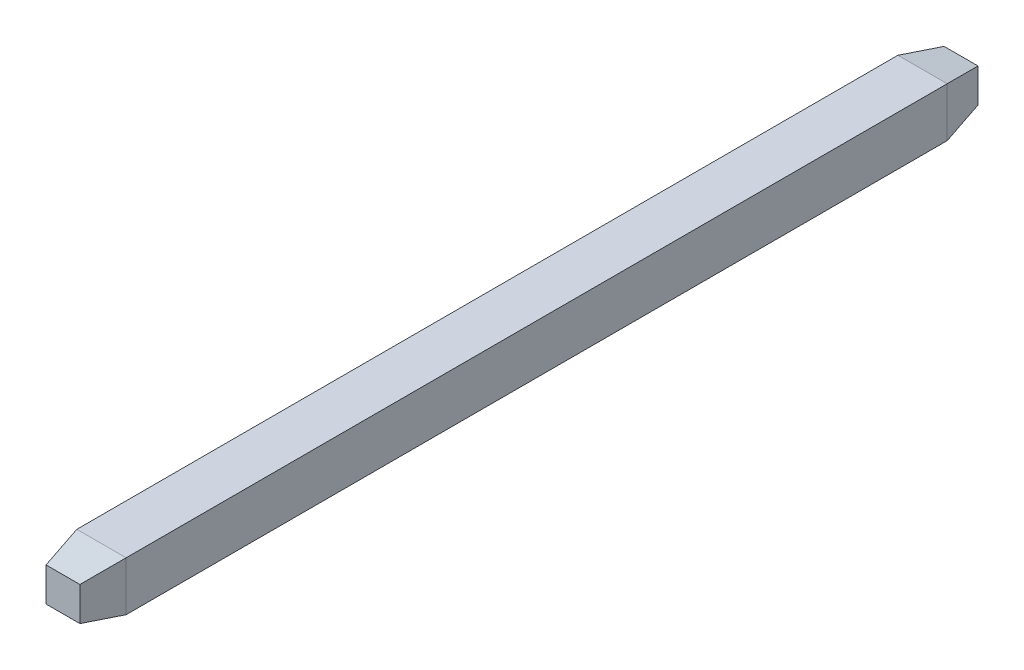
ISO-10303-21;
HEADER;
FILE_DESCRIPTION(('STEP AP214'),'2;1');
FILE_NAME('part.step','',(''),(''),'','','');
FILE_SCHEMA(('AUTOMOTIVE_DESIGN { 1 0 10303 214 1 1 1 1 }'));
ENDSEC;
DATA;
#1=APPLICATION_CONTEXT('core data for automotive mechanical design processes');
#2=APPLICATION_PROTOCOL_DEFINITION('international standard','automotive_design',2000,#1);
#3=PRODUCT_CONTEXT('',#1,'mechanical');
#4=PRODUCT('Part','Part','',(#3));
#5=PRODUCT_RELATED_PRODUCT_CATEGORY('part','',(#4));
#6=PRODUCT_DEFINITION_FORMATION('','',#4);
#7=PRODUCT_DEFINITION_CONTEXT('part definition',#1,'design');
#8=PRODUCT_DEFINITION('design','',#6,#7);
#9=PRODUCT_DEFINITION_SHAPE('','',#8);
#10=(LENGTH_UNIT() NAMED_UNIT(*) SI_UNIT(.MILLI.,.METRE.));
#11=(NAMED_UNIT(*) PLANE_ANGLE_UNIT() SI_UNIT($,.RADIAN.));
#12=(NAMED_UNIT(*) SI_UNIT($,.STERADIAN.) SOLID_ANGLE_UNIT());
#13=UNCERTAINTY_MEASURE_WITH_UNIT(LENGTH_MEASURE(1.E-05),#10,'distance_accuracy_value','');
#14=(GEOMETRIC_REPRESENTATION_CONTEXT(3) GLOBAL_UNCERTAINTY_ASSIGNED_CONTEXT((#13)) GLOBAL_UNIT_ASSIGNED_CONTEXT((#10,
#11,#12)) REPRESENTATION_CONTEXT('',''));
#15=CARTESIAN_POINT('',(0.,0.,0.));
#16=DIRECTION('',(0.,0.,1.));
#17=DIRECTION('',(1.,0.,0.));
#18=AXIS2_PLACEMENT_3D('',#15,#16,#17);
#19=CARTESIAN_POINT('',(-0.269999999999936,0.,-3.0000000000007));
#20=DIRECTION('',(-0.980580675690916,0.,-0.196116135138203));
#21=DIRECTION('',(-0.196116135138203,0.,0.980580675690916));
#22=AXIS2_PLACEMENT_3D('',#19,#20,#21);
#23=PLANE('',#22);
#24=DIRECTION('',(0.192450089729649,0.192450089729903,-0.962250448649416));
#25=VECTOR('',#24,1.);
#26=CARTESIAN_POINT('',(-0.31999999999999,-0.320000000000239,-2.74999999999921));
#27=LINE('',#26,#25);
#28=CARTESIAN_POINT('',(-0.320000000000115,-0.320000000000021,-2.74999999999919));
#29=VERTEX_POINT('',#28);
#30=CARTESIAN_POINT('',(-0.220000000000068,-0.220000000000038,-3.24999999999972));
#31=VERTEX_POINT('',#30);
#32=EDGE_CURVE('E20',#29,#31,#27,.T.);
#33=ORIENTED_EDGE('',*,*,#32,.F.);
#34=DIRECTION('',(0.,1.,0.));
#35=VECTOR('',#34,1.);
#36=CARTESIAN_POINT('',(-0.31999999999999,0.31999999999999,-2.74999999999916));
#37=LINE('',#36,#35);
#38=CARTESIAN_POINT('',(-0.320000000000115,0.320000000000052,-2.7499999999992));
#39=VERTEX_POINT('',#38);
#40=EDGE_CURVE('E104',#39,#29,#37,.F.);
#41=ORIENTED_EDGE('',*,*,#40,.F.);
#42=DIRECTION('',(-0.192450089729649,0.192450089729903,0.962250448649416));
#43=VECTOR('',#42,1.);
#44=CARTESIAN_POINT('',(-0.220000000000009,0.220000000000126,-3.24999999999972));
#45=LINE('',#44,#43);
#46=CARTESIAN_POINT('',(-0.220000000000038,0.220000000000038,-3.24999999999971));
#47=VERTEX_POINT('',#46);
#48=EDGE_CURVE('E85',#47,#39,#45,.T.);
#49=ORIENTED_EDGE('',*,*,#48,.F.);
#50=DIRECTION('',(0.,1.,0.));
#51=VECTOR('',#50,1.);
#52=CARTESIAN_POINT('',(-0.220000000000009,0.,-3.2499999999997));
#53=LINE('',#52,#51);
#54=EDGE_CURVE('E79',#47,#31,#53,.F.);
#55=ORIENTED_EDGE('',*,*,#54,.T.);
#56=EDGE_LOOP('',(#33,#41,#49,#55));
#57=FACE_BOUND('',#56,.T.);
#58=ADVANCED_FACE('F17',(#57),#23,.T.);
#59=CARTESIAN_POINT('',(-0.269999999999936,0.,8.157400000001));
#60=DIRECTION('',(-0.980580675690916,0.,0.196116135138203));
#61=DIRECTION('',(0.196116135138203,0.,0.980580675690916));
#62=AXIS2_PLACEMENT_3D('',#59,#60,#61);
#63=PLANE('',#62);
#64=DIRECTION('',(0.192450089729649,-0.192450089729903,0.962250448649416));
#65=VECTOR('',#64,1.);
#66=CARTESIAN_POINT('',(-0.31999999999999,0.320000000000239,7.90739999999951));
#67=LINE('',#66,#65);
#68=CARTESIAN_POINT('',(-0.320000000000115,0.320000000000021,7.90739999999949));
#69=VERTEX_POINT('',#68);
#70=CARTESIAN_POINT('',(-0.220000000000068,0.220000000000038,8.40740000000002));
#71=VERTEX_POINT('',#70);
#72=EDGE_CURVE('E109',#69,#71,#67,.T.);
#73=ORIENTED_EDGE('',*,*,#72,.F.);
#74=DIRECTION('',(0.,1.,0.));
#75=VECTOR('',#74,1.);
#76=CARTESIAN_POINT('',(-0.31999999999999,0.31999999999999,7.90739999999946));
#77=LINE('',#76,#75);
#78=CARTESIAN_POINT('',(-0.320000000000115,-0.320000000000021,7.90739999999949));
#79=VERTEX_POINT('',#78);
#80=EDGE_CURVE('E106',#79,#69,#77,.T.);
#81=ORIENTED_EDGE('',*,*,#80,.F.);
#82=DIRECTION('',(-0.192450089729649,-0.192450089729903,-0.962250448649416));
#83=VECTOR('',#82,1.);
#84=CARTESIAN_POINT('',(-0.220000000000009,-0.220000000000126,8.40740000000002));
#85=LINE('',#84,#83);
#86=CARTESIAN_POINT('',(-0.220000000000038,-0.220000000000038,8.40740000000001));
#87=VERTEX_POINT('',#86);
#88=EDGE_CURVE('E120',#87,#79,#85,.T.);
#89=ORIENTED_EDGE('',*,*,#88,.F.);
#90=DIRECTION('',(0.,1.,0.));
#91=VECTOR('',#90,1.);
#92=CARTESIAN_POINT('',(-0.220000000000009,0.,8.4074));
#93=LINE('',#92,#91);
#94=EDGE_CURVE('E112',#71,#87,#93,.F.);
#95=ORIENTED_EDGE('',*,*,#94,.F.);
#96=EDGE_LOOP('',(#73,#81,#89,#95));
#97=FACE_BOUND('',#96,.T.);
#98=ADVANCED_FACE('F184',(#97),#63,.T.);
#99=CARTESIAN_POINT('',(0.,-0.269999999999936,-3.0000000000007));
#100=DIRECTION('',(0.,-0.980580675690916,-0.196116135138203));
#101=DIRECTION('',(0.,0.196116135138203,-0.980580675690916));
#102=AXIS2_PLACEMENT_3D('',#99,#100,#101);
#103=PLANE('',#102);
#104=ORIENTED_EDGE('',*,*,#32,.T.);
#105=DIRECTION('',(1.,0.,0.));
#106=VECTOR('',#105,1.);
#107=CARTESIAN_POINT('',(0.,-0.220000000000009,-3.2499999999997));
#108=LINE('',#107,#106);
#109=CARTESIAN_POINT('',(0.220000000000038,-0.220000000000068,-3.24999999999972));
#110=VERTEX_POINT('',#109);
#111=EDGE_CURVE('E87',#31,#110,#108,.T.);
#112=ORIENTED_EDGE('',*,*,#111,.T.);
#113=DIRECTION('',(-0.192450089729903,0.192450089729649,-0.962250448649416));
#114=VECTOR('',#113,1.);
#115=CARTESIAN_POINT('',(0.320000000000239,-0.31999999999999,-2.74999999999921));
#116=LINE('',#115,#114);
#117=CARTESIAN_POINT('',(0.320000000000021,-0.320000000000115,-2.74999999999919));
#118=VERTEX_POINT('',#117);
#119=EDGE_CURVE('E132',#118,#110,#116,.T.);
#120=ORIENTED_EDGE('',*,*,#119,.F.);
#121=DIRECTION('',(1.,0.,0.));
#122=VECTOR('',#121,1.);
#123=CARTESIAN_POINT('',(-0.31999999999999,-0.31999999999999,-2.74999999999916));
#124=LINE('',#123,#122);
#125=EDGE_CURVE('E93',#29,#118,#124,.T.);
#126=ORIENTED_EDGE('',*,*,#125,.F.);
#127=EDGE_LOOP('',(#104,#112,#120,#126));
#128=FACE_BOUND('',#127,.T.);
#129=ADVANCED_FACE('F90',(#128),#103,.T.);
#130=CARTESIAN_POINT('',(0.,0.,-3.2499999999997));
#131=DIRECTION('',(0.,0.,1.));
#132=DIRECTION('',(1.,0.,0.));
#133=AXIS2_PLACEMENT_3D('',#130,#131,#132);
#134=PLANE('',#133);
#135=ORIENTED_EDGE('',*,*,#54,.F.);
#136=DIRECTION('',(1.,0.,0.));
#137=VECTOR('',#136,1.);
#138=CARTESIAN_POINT('',(0.,0.220000000000126,-3.24999999999972));
#139=LINE('',#138,#137);
#140=CARTESIAN_POINT('',(0.220000000000038,0.220000000000068,-3.24999999999972));
#141=VERTEX_POINT('',#140);
#142=EDGE_CURVE('E99',#141,#47,#139,.F.);
#143=ORIENTED_EDGE('',*,*,#142,.F.);
#144=DIRECTION('',(0.,1.,0.));
#145=VECTOR('',#144,1.);
#146=CARTESIAN_POINT('',(0.220000000000126,0.,-3.24999999999972));
#147=LINE('',#146,#145);
#148=EDGE_CURVE('E97',#110,#141,#147,.T.);
#149=ORIENTED_EDGE('',*,*,#148,.F.);
#150=ORIENTED_EDGE('',*,*,#111,.F.);
#151=EDGE_LOOP('',(#135,#143,#149,#150));
#152=FACE_BOUND('',#151,.T.);
#153=ADVANCED_FACE('F95',(#152),#134,.F.);
#154=CARTESIAN_POINT('',(0.,0.269999999999936,-3.0000000000007));
#155=DIRECTION('',(0.,0.980580675690916,-0.196116135138203));
#156=DIRECTION('',(0.,0.196116135138203,0.980580675690916));
#157=AXIS2_PLACEMENT_3D('',#154,#155,#156);
#158=PLANE('',#157);
#159=ORIENTED_EDGE('',*,*,#48,.T.);
#160=DIRECTION('',(1.,0.,0.));
#161=VECTOR('',#160,1.);
#162=CARTESIAN_POINT('',(0.31999999999999,0.31999999999999,-2.74999999999916));
#163=LINE('',#162,#161);
#164=CARTESIAN_POINT('',(0.320000000000052,0.320000000000115,-2.7499999999992));
#165=VERTEX_POINT('',#164);
#166=EDGE_CURVE('E135',#165,#39,#163,.F.);
#167=ORIENTED_EDGE('',*,*,#166,.F.);
#168=DIRECTION('',(0.192450089729903,0.192450089729649,0.962250448649416));
#169=VECTOR('',#168,1.);
#170=CARTESIAN_POINT('',(0.220000000000126,0.220000000000009,-3.24999999999972));
#171=LINE('',#170,#169);
#172=EDGE_CURVE('E129',#141,#165,#171,.T.);
#173=ORIENTED_EDGE('',*,*,#172,.F.);
#174=ORIENTED_EDGE('',*,*,#142,.T.);
#175=EDGE_LOOP('',(#159,#167,#173,#174));
#176=FACE_BOUND('',#175,.T.);
#177=ADVANCED_FACE('F180',(#176),#158,.T.);
#178=CARTESIAN_POINT('',(-0.31999999999999,0.31999999999999,-3.2499999999997));
#179=DIRECTION('',(-1.,0.,0.));
#180=DIRECTION('',(0.,0.,1.));
#181=AXIS2_PLACEMENT_3D('',#178,#179,#180);
#182=PLANE('',#181);
#183=DIRECTION('',(0.,0.,-1.));
#184=VECTOR('',#183,1.);
#185=CARTESIAN_POINT('',(-0.31999999999999,-0.31999999999999,-3.2499999999997));
#186=LINE('',#185,#184);
#187=EDGE_CURVE('E123',#79,#29,#186,.T.);
#188=ORIENTED_EDGE('',*,*,#187,.F.);
#189=ORIENTED_EDGE('',*,*,#80,.T.);
#190=DIRECTION('',(0.,0.,1.));
#191=VECTOR('',#190,1.);
#192=CARTESIAN_POINT('',(-0.31999999999999,0.31999999999999,-3.2499999999997));
#193=LINE('',#192,#191);
#194=EDGE_CURVE('E138',#39,#69,#193,.T.);
#195=ORIENTED_EDGE('',*,*,#194,.F.);
#196=ORIENTED_EDGE('',*,*,#40,.T.);
#197=EDGE_LOOP('',(#188,#189,#195,#196));
#198=FACE_BOUND('',#197,.T.);
#199=ADVANCED_FACE('F182',(#198),#182,.T.);
#200=CARTESIAN_POINT('',(0.,0.269999999999936,8.157400000001));
#201=DIRECTION('',(0.,0.980580675690916,0.196116135138203));
#202=DIRECTION('',(0.,-0.196116135138203,0.980580675690916));
#203=AXIS2_PLACEMENT_3D('',#200,#201,#202);
#204=PLANE('',#203);
#205=ORIENTED_EDGE('',*,*,#72,.T.);
#206=DIRECTION('',(1.,0.,0.));
#207=VECTOR('',#206,1.);
#208=CARTESIAN_POINT('',(0.,0.220000000000009,8.4074));
#209=LINE('',#208,#207);
#210=CARTESIAN_POINT('',(0.220000000000038,0.220000000000068,8.40740000000002));
#211=VERTEX_POINT('',#210);
#212=EDGE_CURVE('E114',#211,#71,#209,.F.);
#213=ORIENTED_EDGE('',*,*,#212,.F.);
#214=DIRECTION('',(-0.192450089729903,-0.192450089729649,0.962250448649416));
#215=VECTOR('',#214,1.);
#216=CARTESIAN_POINT('',(0.320000000000239,0.31999999999999,7.90739999999951));
#217=LINE('',#216,#215);
#218=CARTESIAN_POINT('',(0.320000000000021,0.320000000000115,7.90739999999949));
#219=VERTEX_POINT('',#218);
#220=EDGE_CURVE('E35',#219,#211,#217,.T.);
#221=ORIENTED_EDGE('',*,*,#220,.F.);
#222=DIRECTION('',(1.,0.,0.));
#223=VECTOR('',#222,1.);
#224=CARTESIAN_POINT('',(0.31999999999999,0.31999999999999,7.90739999999946));
#225=LINE('',#224,#223);
#226=EDGE_CURVE('E141',#69,#219,#225,.T.);
#227=ORIENTED_EDGE('',*,*,#226,.F.);
#228=EDGE_LOOP('',(#205,#213,#221,#227));
#229=FACE_BOUND('',#228,.T.);
#230=ADVANCED_FACE('F185',(#229),#204,.T.);
#231=CARTESIAN_POINT('',(0.,0.,8.4074));
#232=DIRECTION('',(0.,0.,1.));
#233=DIRECTION('',(1.,0.,0.));
#234=AXIS2_PLACEMENT_3D('',#231,#232,#233);
#235=PLANE('',#234);
#236=DIRECTION('',(0.,1.,0.));
#237=VECTOR('',#236,1.);
#238=CARTESIAN_POINT('',(0.220000000000126,0.,8.40740000000002));
#239=LINE('',#238,#237);
#240=CARTESIAN_POINT('',(0.220000000000038,-0.220000000000038,8.40740000000001));
#241=VERTEX_POINT('',#240);
#242=EDGE_CURVE('E144',#211,#241,#239,.F.);
#243=ORIENTED_EDGE('',*,*,#242,.F.);
#244=ORIENTED_EDGE('',*,*,#212,.T.);
#245=ORIENTED_EDGE('',*,*,#94,.T.);
#246=DIRECTION('',(1.,0.,0.));
#247=VECTOR('',#246,1.);
#248=CARTESIAN_POINT('',(0.,-0.220000000000126,8.40740000000002));
#249=LINE('',#248,#247);
#250=EDGE_CURVE('E117',#241,#87,#249,.F.);
#251=ORIENTED_EDGE('',*,*,#250,.F.);
#252=EDGE_LOOP('',(#243,#244,#245,#251));
#253=FACE_BOUND('',#252,.T.);
#254=ADVANCED_FACE('F187',(#253),#235,.T.);
#255=CARTESIAN_POINT('',(0.,-0.269999999999936,8.157400000001));
#256=DIRECTION('',(0.,-0.980580675690916,0.196116135138203));
#257=DIRECTION('',(0.,-0.196116135138203,-0.980580675690916));
#258=AXIS2_PLACEMENT_3D('',#255,#256,#257);
#259=PLANE('',#258);
#260=ORIENTED_EDGE('',*,*,#88,.T.);
#261=DIRECTION('',(1.,0.,0.));
#262=VECTOR('',#261,1.);
#263=CARTESIAN_POINT('',(-0.31999999999999,-0.31999999999999,7.90739999999946));
#264=LINE('',#263,#262);
#265=CARTESIAN_POINT('',(0.320000000000021,-0.320000000000115,7.90739999999949));
#266=VERTEX_POINT('',#265);
#267=EDGE_CURVE('E126',#266,#79,#264,.F.);
#268=ORIENTED_EDGE('',*,*,#267,.F.);
#269=DIRECTION('',(0.192450089729903,-0.192450089729649,-0.962250448649416));
#270=VECTOR('',#269,1.);
#271=CARTESIAN_POINT('',(0.220000000000126,-0.220000000000009,8.40740000000002));
#272=LINE('',#271,#270);
#273=EDGE_CURVE('E147',#241,#266,#272,.T.);
#274=ORIENTED_EDGE('',*,*,#273,.F.);
#275=ORIENTED_EDGE('',*,*,#250,.T.);
#276=EDGE_LOOP('',(#260,#268,#274,#275));
#277=FACE_BOUND('',#276,.T.);
#278=ADVANCED_FACE('F170',(#277),#259,.T.);
#279=CARTESIAN_POINT('',(-0.31999999999999,-0.31999999999999,-3.2499999999997));
#280=DIRECTION('',(0.,-1.,0.));
#281=DIRECTION('',(0.,0.,-1.));
#282=AXIS2_PLACEMENT_3D('',#279,#280,#281);
#283=PLANE('',#282);
#284=DIRECTION('',(0.,0.,-1.));
#285=VECTOR('',#284,1.);
#286=CARTESIAN_POINT('',(0.31999999999999,-0.31999999999999,-3.2499999999997));
#287=LINE('',#286,#285);
#288=EDGE_CURVE('E150',#266,#118,#287,.T.);
#289=ORIENTED_EDGE('',*,*,#288,.F.);
#290=ORIENTED_EDGE('',*,*,#267,.T.);
#291=ORIENTED_EDGE('',*,*,#187,.T.);
#292=ORIENTED_EDGE('',*,*,#125,.T.);
#293=EDGE_LOOP('',(#289,#290,#291,#292));
#294=FACE_BOUND('',#293,.T.);
#295=ADVANCED_FACE('F174',(#294),#283,.T.);
#296=CARTESIAN_POINT('',(0.269999999999936,0.,-3.0000000000007));
#297=DIRECTION('',(0.980580675690916,0.,-0.196116135138203));
#298=DIRECTION('',(-0.196116135138203,0.,-0.980580675690916));
#299=AXIS2_PLACEMENT_3D('',#296,#297,#298);
#300=PLANE('',#299);
#301=ORIENTED_EDGE('',*,*,#119,.T.);
#302=ORIENTED_EDGE('',*,*,#148,.T.);
#303=ORIENTED_EDGE('',*,*,#172,.T.);
#304=DIRECTION('',(0.,1.,0.));
#305=VECTOR('',#304,1.);
#306=CARTESIAN_POINT('',(0.31999999999999,-0.31999999999999,-2.74999999999916));
#307=LINE('',#306,#305);
#308=EDGE_CURVE('E153',#118,#165,#307,.T.);
#309=ORIENTED_EDGE('',*,*,#308,.F.);
#310=EDGE_LOOP('',(#301,#302,#303,#309));
#311=FACE_BOUND('',#310,.T.);
#312=ADVANCED_FACE('F177',(#311),#300,.T.);
#313=CARTESIAN_POINT('',(0.31999999999999,0.31999999999999,-3.2499999999997));
#314=DIRECTION('',(0.,1.,0.));
#315=DIRECTION('',(0.,0.,1.));
#316=AXIS2_PLACEMENT_3D('',#313,#314,#315);
#317=PLANE('',#316);
#318=ORIENTED_EDGE('',*,*,#194,.T.);
#319=ORIENTED_EDGE('',*,*,#226,.T.);
#320=DIRECTION('',(0.,0.,-1.));
#321=VECTOR('',#320,1.);
#322=CARTESIAN_POINT('',(0.31999999999999,0.31999999999999,-3.2499999999997));
#323=LINE('',#322,#321);
#324=EDGE_CURVE('E26',#165,#219,#323,.F.);
#325=ORIENTED_EDGE('',*,*,#324,.F.);
#326=ORIENTED_EDGE('',*,*,#166,.T.);
#327=EDGE_LOOP('',(#318,#319,#325,#326));
#328=FACE_BOUND('',#327,.T.);
#329=ADVANCED_FACE('F163',(#328),#317,.T.);
#330=CARTESIAN_POINT('',(0.269999999999936,0.,8.157400000001));
#331=DIRECTION('',(0.980580675690916,0.,0.196116135138203));
#332=DIRECTION('',(0.196116135138203,0.,-0.980580675690916));
#333=AXIS2_PLACEMENT_3D('',#330,#331,#332);
#334=PLANE('',#333);
#335=ORIENTED_EDGE('',*,*,#273,.T.);
#336=DIRECTION('',(0.,1.,0.));
#337=VECTOR('',#336,1.);
#338=CARTESIAN_POINT('',(0.31999999999999,-0.31999999999999,7.90739999999946));
#339=LINE('',#338,#337);
#340=EDGE_CURVE('E11',#219,#266,#339,.F.);
#341=ORIENTED_EDGE('',*,*,#340,.F.);
#342=ORIENTED_EDGE('',*,*,#220,.T.);
#343=ORIENTED_EDGE('',*,*,#242,.T.);
#344=EDGE_LOOP('',(#335,#341,#342,#343));
#345=FACE_BOUND('',#344,.T.);
#346=ADVANCED_FACE('F166',(#345),#334,.T.);
#347=CARTESIAN_POINT('',(0.31999999999999,-0.31999999999999,-3.2499999999997));
#348=DIRECTION('',(1.,0.,0.));
#349=DIRECTION('',(0.,0.,-1.));
#350=AXIS2_PLACEMENT_3D('',#347,#348,#349);
#351=PLANE('',#350);
#352=ORIENTED_EDGE('',*,*,#324,.T.);
#353=ORIENTED_EDGE('',*,*,#340,.T.);
#354=ORIENTED_EDGE('',*,*,#288,.T.);
#355=ORIENTED_EDGE('',*,*,#308,.T.);
#356=EDGE_LOOP('',(#352,#353,#354,#355));
#357=FACE_BOUND('',#356,.T.);
#358=ADVANCED_FACE('F159',(#357),#351,.T.);
#359=CLOSED_SHELL('',(#58,#98,#129,#153,#177,#199,#230,#254,#278,#295,#312,#329,#346,#358));
#360=MANIFOLD_SOLID_BREP('B1',#359);
#361=ADVANCED_BREP_SHAPE_REPRESENTATION('',(#18,#360),#14);
#362=SHAPE_DEFINITION_REPRESENTATION(#9,#361);
ENDSEC;
END-ISO-10303-21;
